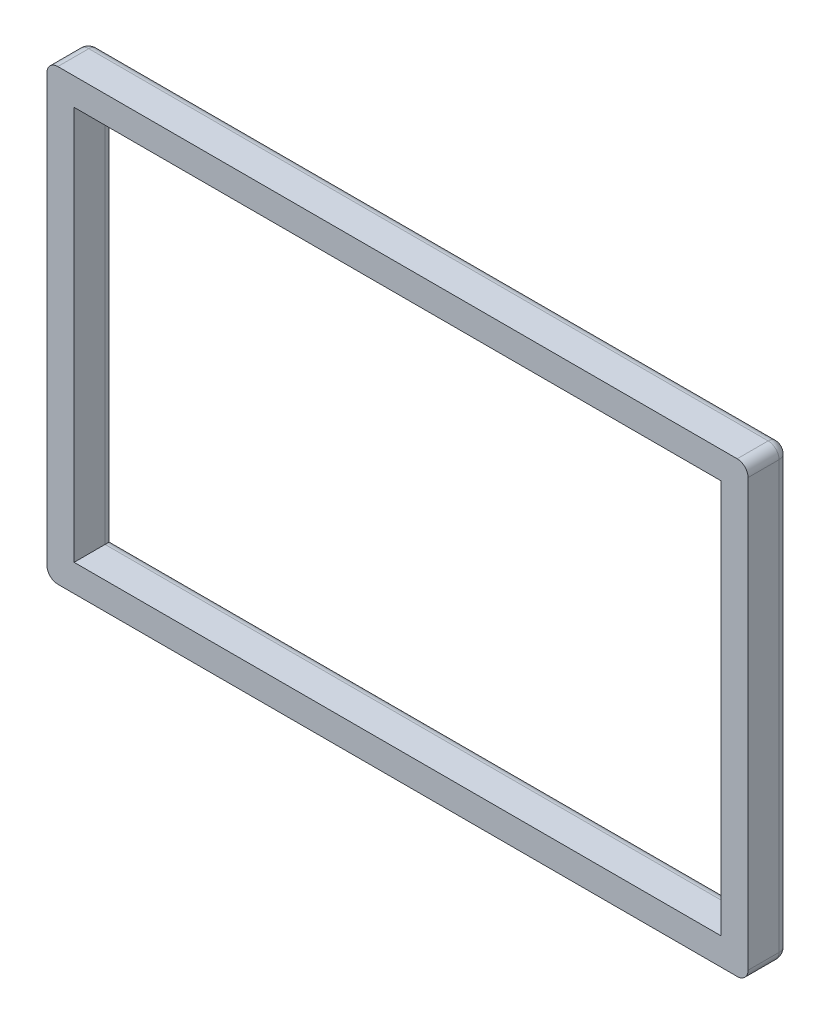
ISO-10303-21;
HEADER;
FILE_DESCRIPTION(('STEP AP214'),'2;1');
FILE_NAME('part.step','',(''),(''),'','','');
FILE_SCHEMA(('AUTOMOTIVE_DESIGN { 1 0 10303 214 1 1 1 1 }'));
ENDSEC;
DATA;
#1=APPLICATION_CONTEXT('core data for automotive mechanical design processes');
#2=APPLICATION_PROTOCOL_DEFINITION('international standard','automotive_design',2000,#1);
#3=PRODUCT_CONTEXT('',#1,'mechanical');
#4=PRODUCT('Part','Part','',(#3));
#5=PRODUCT_RELATED_PRODUCT_CATEGORY('part','',(#4));
#6=PRODUCT_DEFINITION_FORMATION('','',#4);
#7=PRODUCT_DEFINITION_CONTEXT('part definition',#1,'design');
#8=PRODUCT_DEFINITION('design','',#6,#7);
#9=PRODUCT_DEFINITION_SHAPE('','',#8);
#10=(LENGTH_UNIT() NAMED_UNIT(*) SI_UNIT(.MILLI.,.METRE.));
#11=(NAMED_UNIT(*) PLANE_ANGLE_UNIT() SI_UNIT($,.RADIAN.));
#12=(NAMED_UNIT(*) SI_UNIT($,.STERADIAN.) SOLID_ANGLE_UNIT());
#13=UNCERTAINTY_MEASURE_WITH_UNIT(LENGTH_MEASURE(1.E-05),#10,'distance_accuracy_value','');
#14=(GEOMETRIC_REPRESENTATION_CONTEXT(3) GLOBAL_UNCERTAINTY_ASSIGNED_CONTEXT((#13)) GLOBAL_UNIT_ASSIGNED_CONTEXT((#10,
#11,#12)) REPRESENTATION_CONTEXT('',''));
#15=CARTESIAN_POINT('',(0.,0.,0.));
#16=DIRECTION('',(0.,0.,1.));
#17=DIRECTION('',(1.,0.,0.));
#18=AXIS2_PLACEMENT_3D('',#15,#16,#17);
#19=CARTESIAN_POINT('',(0.,0.,9.525));
#20=DIRECTION('',(0.,0.,-1.));
#21=DIRECTION('',(-1.,0.,0.));
#22=AXIS2_PLACEMENT_3D('',#19,#20,#21);
#23=PLANE('',#22);
#24=DIRECTION('',(0.,-1.,0.));
#25=VECTOR('',#24,1.);
#26=CARTESIAN_POINT('',(-81.915,-52.3875,9.525));
#27=LINE('',#26,#25);
#28=CARTESIAN_POINT('',(-81.915,49.8475,9.525));
#29=VERTEX_POINT('',#28);
#30=CARTESIAN_POINT('',(-81.915,-49.8475,9.525));
#31=VERTEX_POINT('',#30);
#32=EDGE_CURVE('E204',#29,#31,#27,.T.);
#33=ORIENTED_EDGE('',*,*,#32,.T.);
#34=CARTESIAN_POINT('',(-79.375,-49.8475,9.525));
#35=DIRECTION('',(0.,0.,-1.));
#36=DIRECTION('',(-1.,0.,0.));
#37=AXIS2_PLACEMENT_3D('',#34,#35,#36);
#38=CIRCLE('',#37,2.54);
#39=CARTESIAN_POINT('',(-79.375,-52.3875,9.525));
#40=VERTEX_POINT('',#39);
#41=EDGE_CURVE('E224',#31,#40,#38,.F.);
#42=ORIENTED_EDGE('',*,*,#41,.T.);
#43=DIRECTION('',(1.,0.,0.));
#44=VECTOR('',#43,1.);
#45=CARTESIAN_POINT('',(-81.915,-52.3875,9.525));
#46=LINE('',#45,#44);
#47=CARTESIAN_POINT('',(79.3749999999999,-52.3875,9.525));
#48=VERTEX_POINT('',#47);
#49=EDGE_CURVE('E207',#40,#48,#46,.T.);
#50=ORIENTED_EDGE('',*,*,#49,.T.);
#51=CARTESIAN_POINT('',(79.375,-49.8475,9.525));
#52=DIRECTION('',(0.,0.,-1.));
#53=DIRECTION('',(-1.,0.,0.));
#54=AXIS2_PLACEMENT_3D('',#51,#52,#53);
#55=CIRCLE('',#54,2.54);
#56=CARTESIAN_POINT('',(81.915,-49.8475,9.525));
#57=VERTEX_POINT('',#56);
#58=EDGE_CURVE('E218',#48,#57,#55,.F.);
#59=ORIENTED_EDGE('',*,*,#58,.T.);
#60=DIRECTION('',(0.,1.,0.));
#61=VECTOR('',#60,1.);
#62=CARTESIAN_POINT('',(81.915,-52.3875,9.525));
#63=LINE('',#62,#61);
#64=CARTESIAN_POINT('',(81.915,49.8475,9.525));
#65=VERTEX_POINT('',#64);
#66=EDGE_CURVE('E183',#57,#65,#63,.T.);
#67=ORIENTED_EDGE('',*,*,#66,.T.);
#68=CARTESIAN_POINT('',(79.375,49.8475,9.525));
#69=DIRECTION('',(0.,0.,-1.));
#70=DIRECTION('',(-1.,0.,0.));
#71=AXIS2_PLACEMENT_3D('',#68,#69,#70);
#72=CIRCLE('',#71,2.54);
#73=CARTESIAN_POINT('',(79.3749999999999,52.3875,9.525));
#74=VERTEX_POINT('',#73);
#75=EDGE_CURVE('E220',#65,#74,#72,.F.);
#76=ORIENTED_EDGE('',*,*,#75,.T.);
#77=DIRECTION('',(-1.,0.,0.));
#78=VECTOR('',#77,1.);
#79=CARTESIAN_POINT('',(-81.915,52.3875,9.525));
#80=LINE('',#79,#78);
#81=CARTESIAN_POINT('',(-79.375,52.3875,9.525));
#82=VERTEX_POINT('',#81);
#83=EDGE_CURVE('E201',#74,#82,#80,.T.);
#84=ORIENTED_EDGE('',*,*,#83,.T.);
#85=CARTESIAN_POINT('',(-79.375,49.8475,9.525));
#86=DIRECTION('',(0.,0.,-1.));
#87=DIRECTION('',(-1.,0.,0.));
#88=AXIS2_PLACEMENT_3D('',#85,#86,#87);
#89=CIRCLE('',#88,2.54);
#90=EDGE_CURVE('E222',#82,#29,#89,.F.);
#91=ORIENTED_EDGE('',*,*,#90,.T.);
#92=EDGE_LOOP('',(#33,#42,#50,#59,#67,#76,#84,#91));
#93=FACE_BOUND('',#92,.T.);
#94=DIRECTION('',(0.,1.,0.));
#95=VECTOR('',#94,1.);
#96=CARTESIAN_POINT('',(75.565,-46.0375,9.525));
#97=LINE('',#96,#95);
#98=CARTESIAN_POINT('',(75.565,-46.0375,9.525));
#99=VERTEX_POINT('',#98);
#100=CARTESIAN_POINT('',(75.565,46.0375,9.525));
#101=VERTEX_POINT('',#100);
#102=EDGE_CURVE('E164',#99,#101,#97,.T.);
#103=ORIENTED_EDGE('',*,*,#102,.F.);
#104=DIRECTION('',(1.,0.,0.));
#105=VECTOR('',#104,1.);
#106=CARTESIAN_POINT('',(-75.565,-46.0375,9.525));
#107=LINE('',#106,#105);
#108=CARTESIAN_POINT('',(-75.565,-46.0375,9.525));
#109=VERTEX_POINT('',#108);
#110=EDGE_CURVE('E190',#109,#99,#107,.T.);
#111=ORIENTED_EDGE('',*,*,#110,.F.);
#112=DIRECTION('',(0.,-1.,0.));
#113=VECTOR('',#112,1.);
#114=CARTESIAN_POINT('',(-75.565,-46.0375,9.525));
#115=LINE('',#114,#113);
#116=CARTESIAN_POINT('',(-75.565,46.0375,9.525));
#117=VERTEX_POINT('',#116);
#118=EDGE_CURVE('E188',#117,#109,#115,.T.);
#119=ORIENTED_EDGE('',*,*,#118,.F.);
#120=DIRECTION('',(-1.,0.,0.));
#121=VECTOR('',#120,1.);
#122=CARTESIAN_POINT('',(-75.565,46.0375,9.525));
#123=LINE('',#122,#121);
#124=EDGE_CURVE('E174',#101,#117,#123,.T.);
#125=ORIENTED_EDGE('',*,*,#124,.F.);
#126=EDGE_LOOP('',(#103,#111,#119,#125));
#127=FACE_BOUND('',#126,.T.);
#128=ADVANCED_FACE('F36',(#93,#127),#23,.F.);
#129=CARTESIAN_POINT('',(0.,0.,0.));
#130=DIRECTION('',(0.,0.,-1.));
#131=DIRECTION('',(-1.,0.,0.));
#132=AXIS2_PLACEMENT_3D('',#129,#130,#131);
#133=PLANE('',#132);
#134=DIRECTION('',(-1.,0.,0.));
#135=VECTOR('',#134,1.);
#136=CARTESIAN_POINT('',(0.,48.3235,0.));
#137=LINE('',#136,#135);
#138=CARTESIAN_POINT('',(77.851,48.3235,0.));
#139=VERTEX_POINT('',#138);
#140=CARTESIAN_POINT('',(-77.851,48.3235,0.));
#141=VERTEX_POINT('',#140);
#142=EDGE_CURVE('E257',#139,#141,#137,.T.);
#143=ORIENTED_EDGE('',*,*,#142,.T.);
#144=DIRECTION('',(0.,-1.,0.));
#145=VECTOR('',#144,1.);
#146=CARTESIAN_POINT('',(-77.851,0.,0.));
#147=LINE('',#146,#145);
#148=CARTESIAN_POINT('',(-77.851,-48.3235,0.));
#149=VERTEX_POINT('',#148);
#150=EDGE_CURVE('E259',#141,#149,#147,.T.);
#151=ORIENTED_EDGE('',*,*,#150,.T.);
#152=DIRECTION('',(1.,0.,0.));
#153=VECTOR('',#152,1.);
#154=CARTESIAN_POINT('',(0.,-48.3235,0.));
#155=LINE('',#154,#153);
#156=CARTESIAN_POINT('',(77.851,-48.3235,0.));
#157=VERTEX_POINT('',#156);
#158=EDGE_CURVE('E253',#149,#157,#155,.T.);
#159=ORIENTED_EDGE('',*,*,#158,.T.);
#160=DIRECTION('',(0.,1.,0.));
#161=VECTOR('',#160,1.);
#162=CARTESIAN_POINT('',(77.851,0.,0.));
#163=LINE('',#162,#161);
#164=EDGE_CURVE('E255',#157,#139,#163,.T.);
#165=ORIENTED_EDGE('',*,*,#164,.T.);
#166=EDGE_LOOP('',(#143,#151,#159,#165));
#167=FACE_BOUND('',#166,.T.);
#168=DIRECTION('',(0.,1.,0.));
#169=VECTOR('',#168,1.);
#170=CARTESIAN_POINT('',(79.629,-49.8475,0.));
#171=LINE('',#170,#169);
#172=CARTESIAN_POINT('',(79.629,49.8475,0.));
#173=VERTEX_POINT('',#172);
#174=CARTESIAN_POINT('',(79.629,-49.8475,0.));
#175=VERTEX_POINT('',#174);
#176=EDGE_CURVE('E248',#173,#175,#171,.F.);
#177=ORIENTED_EDGE('',*,*,#176,.T.);
#178=CARTESIAN_POINT('',(79.375,-49.8475,0.));
#179=DIRECTION('',(0.,0.,-1.));
#180=DIRECTION('',(-1.,0.,0.));
#181=AXIS2_PLACEMENT_3D('',#178,#179,#180);
#182=CIRCLE('',#181,0.254);
#183=CARTESIAN_POINT('',(79.375,-50.1015,0.));
#184=VERTEX_POINT('',#183);
#185=EDGE_CURVE('E250',#175,#184,#182,.T.);
#186=ORIENTED_EDGE('',*,*,#185,.T.);
#187=DIRECTION('',(1.,0.,0.));
#188=VECTOR('',#187,1.);
#189=CARTESIAN_POINT('',(-79.375,-50.1015,0.));
#190=LINE('',#189,#188);
#191=CARTESIAN_POINT('',(-79.375,-50.1015,0.));
#192=VERTEX_POINT('',#191);
#193=EDGE_CURVE('E236',#184,#192,#190,.F.);
#194=ORIENTED_EDGE('',*,*,#193,.T.);
#195=CARTESIAN_POINT('',(-79.375,-49.8475,0.));
#196=DIRECTION('',(0.,0.,-1.));
#197=DIRECTION('',(-1.,0.,0.));
#198=AXIS2_PLACEMENT_3D('',#195,#196,#197);
#199=CIRCLE('',#198,0.254);
#200=CARTESIAN_POINT('',(-79.629,-49.8475,0.));
#201=VERTEX_POINT('',#200);
#202=EDGE_CURVE('E238',#192,#201,#199,.T.);
#203=ORIENTED_EDGE('',*,*,#202,.T.);
#204=DIRECTION('',(0.,-1.,0.));
#205=VECTOR('',#204,1.);
#206=CARTESIAN_POINT('',(-79.629,49.8475,0.));
#207=LINE('',#206,#205);
#208=CARTESIAN_POINT('',(-79.629,49.8475,0.));
#209=VERTEX_POINT('',#208);
#210=EDGE_CURVE('E240',#201,#209,#207,.F.);
#211=ORIENTED_EDGE('',*,*,#210,.T.);
#212=CARTESIAN_POINT('',(-79.375,49.8475,0.));
#213=DIRECTION('',(0.,0.,-1.));
#214=DIRECTION('',(-1.,0.,0.));
#215=AXIS2_PLACEMENT_3D('',#212,#213,#214);
#216=CIRCLE('',#215,0.254);
#217=CARTESIAN_POINT('',(-79.375,50.1015,0.));
#218=VERTEX_POINT('',#217);
#219=EDGE_CURVE('E242',#209,#218,#216,.T.);
#220=ORIENTED_EDGE('',*,*,#219,.T.);
#221=DIRECTION('',(-1.,0.,0.));
#222=VECTOR('',#221,1.);
#223=CARTESIAN_POINT('',(79.3749999999999,50.1015,0.));
#224=LINE('',#223,#222);
#225=CARTESIAN_POINT('',(79.375,50.1015,0.));
#226=VERTEX_POINT('',#225);
#227=EDGE_CURVE('E244',#218,#226,#224,.F.);
#228=ORIENTED_EDGE('',*,*,#227,.T.);
#229=CARTESIAN_POINT('',(79.375,49.8475,0.));
#230=DIRECTION('',(0.,0.,-1.));
#231=DIRECTION('',(-1.,0.,0.));
#232=AXIS2_PLACEMENT_3D('',#229,#230,#231);
#233=CIRCLE('',#232,0.254);
#234=EDGE_CURVE('E246',#226,#173,#233,.T.);
#235=ORIENTED_EDGE('',*,*,#234,.T.);
#236=EDGE_LOOP('',(#177,#186,#194,#203,#211,#220,#228,#235));
#237=FACE_BOUND('',#236,.T.);
#238=ADVANCED_FACE('F375',(#167,#237),#133,.T.);
#239=CARTESIAN_POINT('',(81.915,-52.3875,9.525));
#240=DIRECTION('',(-1.,0.,0.));
#241=DIRECTION('',(0.,0.,1.));
#242=AXIS2_PLACEMENT_3D('',#239,#240,#241);
#243=PLANE('',#242);
#244=DIRECTION('',(0.,0.,-1.));
#245=VECTOR('',#244,1.);
#246=CARTESIAN_POINT('',(81.915,-49.8475,9.525));
#247=LINE('',#246,#245);
#248=CARTESIAN_POINT('',(81.915,-49.8475,2.286));
#249=VERTEX_POINT('',#248);
#250=EDGE_CURVE('E231',#57,#249,#247,.T.);
#251=ORIENTED_EDGE('',*,*,#250,.T.);
#252=DIRECTION('',(0.,1.,0.));
#253=VECTOR('',#252,1.);
#254=CARTESIAN_POINT('',(81.915,49.8475,2.286));
#255=LINE('',#254,#253);
#256=CARTESIAN_POINT('',(81.915,49.8475,2.286));
#257=VERTEX_POINT('',#256);
#258=EDGE_CURVE('E273',#249,#257,#255,.T.);
#259=ORIENTED_EDGE('',*,*,#258,.T.);
#260=DIRECTION('',(0.,0.,-1.));
#261=VECTOR('',#260,1.);
#262=CARTESIAN_POINT('',(81.915,49.8475,9.525));
#263=LINE('',#262,#261);
#264=EDGE_CURVE('E234',#257,#65,#263,.F.);
#265=ORIENTED_EDGE('',*,*,#264,.T.);
#266=ORIENTED_EDGE('',*,*,#66,.F.);
#267=EDGE_LOOP('',(#251,#259,#265,#266));
#268=FACE_BOUND('',#267,.T.);
#269=ADVANCED_FACE('F358',(#268),#243,.F.);
#270=CARTESIAN_POINT('',(-81.915,52.3875,9.525));
#271=DIRECTION('',(0.,-1.,0.));
#272=DIRECTION('',(0.,0.,-1.));
#273=AXIS2_PLACEMENT_3D('',#270,#271,#272);
#274=PLANE('',#273);
#275=DIRECTION('',(0.,0.,-1.));
#276=VECTOR('',#275,1.);
#277=CARTESIAN_POINT('',(79.375,52.3875,9.525));
#278=LINE('',#277,#276);
#279=CARTESIAN_POINT('',(79.375,52.3875,2.286));
#280=VERTEX_POINT('',#279);
#281=EDGE_CURVE('E226',#74,#280,#278,.T.);
#282=ORIENTED_EDGE('',*,*,#281,.T.);
#283=DIRECTION('',(-1.,0.,0.));
#284=VECTOR('',#283,1.);
#285=CARTESIAN_POINT('',(-79.375,52.3875,2.286));
#286=LINE('',#285,#284);
#287=CARTESIAN_POINT('',(-79.375,52.3875,2.286));
#288=VERTEX_POINT('',#287);
#289=EDGE_CURVE('E277',#280,#288,#286,.T.);
#290=ORIENTED_EDGE('',*,*,#289,.T.);
#291=DIRECTION('',(0.,0.,-1.));
#292=VECTOR('',#291,1.);
#293=CARTESIAN_POINT('',(-79.375,52.3875,9.525));
#294=LINE('',#293,#292);
#295=EDGE_CURVE('E229',#288,#82,#294,.F.);
#296=ORIENTED_EDGE('',*,*,#295,.T.);
#297=ORIENTED_EDGE('',*,*,#83,.F.);
#298=EDGE_LOOP('',(#282,#290,#296,#297));
#299=FACE_BOUND('',#298,.T.);
#300=ADVANCED_FACE('F367',(#299),#274,.F.);
#301=CARTESIAN_POINT('',(-81.915,-52.3875,9.525));
#302=DIRECTION('',(1.,0.,0.));
#303=DIRECTION('',(0.,0.,-1.));
#304=AXIS2_PLACEMENT_3D('',#301,#302,#303);
#305=PLANE('',#304);
#306=DIRECTION('',(0.,0.,-1.));
#307=VECTOR('',#306,1.);
#308=CARTESIAN_POINT('',(-81.915,49.8475,9.525));
#309=LINE('',#308,#307);
#310=CARTESIAN_POINT('',(-81.915,49.8475,2.286));
#311=VERTEX_POINT('',#310);
#312=EDGE_CURVE('E214',#29,#311,#309,.T.);
#313=ORIENTED_EDGE('',*,*,#312,.T.);
#314=DIRECTION('',(0.,-1.,0.));
#315=VECTOR('',#314,1.);
#316=CARTESIAN_POINT('',(-81.915,-49.8475,2.286));
#317=LINE('',#316,#315);
#318=CARTESIAN_POINT('',(-81.915,-49.8475,2.286));
#319=VERTEX_POINT('',#318);
#320=EDGE_CURVE('E60',#311,#319,#317,.T.);
#321=ORIENTED_EDGE('',*,*,#320,.T.);
#322=DIRECTION('',(0.,0.,-1.));
#323=VECTOR('',#322,1.);
#324=CARTESIAN_POINT('',(-81.915,-49.8475,9.525));
#325=LINE('',#324,#323);
#326=EDGE_CURVE('E216',#319,#31,#325,.F.);
#327=ORIENTED_EDGE('',*,*,#326,.T.);
#328=ORIENTED_EDGE('',*,*,#32,.F.);
#329=EDGE_LOOP('',(#313,#321,#327,#328));
#330=FACE_BOUND('',#329,.T.);
#331=ADVANCED_FACE('F328',(#330),#305,.F.);
#332=CARTESIAN_POINT('',(-81.915,-52.3875,9.525));
#333=DIRECTION('',(0.,1.,0.));
#334=DIRECTION('',(0.,0.,1.));
#335=AXIS2_PLACEMENT_3D('',#332,#333,#334);
#336=PLANE('',#335);
#337=DIRECTION('',(0.,0.,-1.));
#338=VECTOR('',#337,1.);
#339=CARTESIAN_POINT('',(-79.375,-52.3875,9.525));
#340=LINE('',#339,#338);
#341=CARTESIAN_POINT('',(-79.375,-52.3875,2.286));
#342=VERTEX_POINT('',#341);
#343=EDGE_CURVE('E212',#40,#342,#340,.T.);
#344=ORIENTED_EDGE('',*,*,#343,.T.);
#345=DIRECTION('',(1.,0.,0.));
#346=VECTOR('',#345,1.);
#347=CARTESIAN_POINT('',(79.3749999999999,-52.3875,2.286));
#348=LINE('',#347,#346);
#349=CARTESIAN_POINT('',(79.375,-52.3875,2.286));
#350=VERTEX_POINT('',#349);
#351=EDGE_CURVE('E11',#342,#350,#348,.T.);
#352=ORIENTED_EDGE('',*,*,#351,.T.);
#353=DIRECTION('',(0.,0.,-1.));
#354=VECTOR('',#353,1.);
#355=CARTESIAN_POINT('',(79.375,-52.3875,9.525));
#356=LINE('',#355,#354);
#357=EDGE_CURVE('E210',#350,#48,#356,.F.);
#358=ORIENTED_EDGE('',*,*,#357,.T.);
#359=ORIENTED_EDGE('',*,*,#49,.F.);
#360=EDGE_LOOP('',(#344,#352,#358,#359));
#361=FACE_BOUND('',#360,.T.);
#362=ADVANCED_FACE('F336',(#361),#336,.F.);
#363=CARTESIAN_POINT('',(75.565,-46.0375,9.525));
#364=DIRECTION('',(-1.,0.,0.));
#365=DIRECTION('',(0.,0.,1.));
#366=AXIS2_PLACEMENT_3D('',#363,#364,#365);
#367=PLANE('',#366);
#368=DIRECTION('',(0.,0.,-1.));
#369=VECTOR('',#368,1.);
#370=CARTESIAN_POINT('',(75.565,46.0375,9.525));
#371=LINE('',#370,#369);
#372=CARTESIAN_POINT('',(75.565,46.0375,2.286));
#373=VERTEX_POINT('',#372);
#374=EDGE_CURVE('E167',#101,#373,#371,.T.);
#375=ORIENTED_EDGE('',*,*,#374,.T.);
#376=DIRECTION('',(0.,1.,0.));
#377=VECTOR('',#376,1.);
#378=CARTESIAN_POINT('',(75.565,-46.0375,2.286));
#379=LINE('',#378,#377);
#380=CARTESIAN_POINT('',(75.565,-46.0375,2.286));
#381=VERTEX_POINT('',#380);
#382=EDGE_CURVE('E266',#373,#381,#379,.F.);
#383=ORIENTED_EDGE('',*,*,#382,.T.);
#384=DIRECTION('',(0.,0.,-1.));
#385=VECTOR('',#384,1.);
#386=CARTESIAN_POINT('',(75.565,-46.0375,9.525));
#387=LINE('',#386,#385);
#388=EDGE_CURVE('E170',#99,#381,#387,.T.);
#389=ORIENTED_EDGE('',*,*,#388,.F.);
#390=ORIENTED_EDGE('',*,*,#102,.T.);
#391=EDGE_LOOP('',(#375,#383,#389,#390));
#392=FACE_BOUND('',#391,.T.);
#393=ADVANCED_FACE('F166',(#392),#367,.T.);
#394=CARTESIAN_POINT('',(-75.565,46.0375,9.525));
#395=DIRECTION('',(0.,-1.,0.));
#396=DIRECTION('',(0.,0.,-1.));
#397=AXIS2_PLACEMENT_3D('',#394,#395,#396);
#398=PLANE('',#397);
#399=DIRECTION('',(0.,0.,-1.));
#400=VECTOR('',#399,1.);
#401=CARTESIAN_POINT('',(-75.565,46.0375,9.525));
#402=LINE('',#401,#400);
#403=CARTESIAN_POINT('',(-75.565,46.0375,2.286));
#404=VERTEX_POINT('',#403);
#405=EDGE_CURVE('E184',#117,#404,#402,.T.);
#406=ORIENTED_EDGE('',*,*,#405,.T.);
#407=DIRECTION('',(-1.,0.,0.));
#408=VECTOR('',#407,1.);
#409=CARTESIAN_POINT('',(-75.565,46.0375,2.286));
#410=LINE('',#409,#408);
#411=EDGE_CURVE('E182',#404,#373,#410,.F.);
#412=ORIENTED_EDGE('',*,*,#411,.T.);
#413=ORIENTED_EDGE('',*,*,#374,.F.);
#414=ORIENTED_EDGE('',*,*,#124,.T.);
#415=EDGE_LOOP('',(#406,#412,#413,#414));
#416=FACE_BOUND('',#415,.T.);
#417=ADVANCED_FACE('F179',(#416),#398,.T.);
#418=CARTESIAN_POINT('',(-75.565,-46.0375,9.525));
#419=DIRECTION('',(1.,0.,0.));
#420=DIRECTION('',(0.,0.,-1.));
#421=AXIS2_PLACEMENT_3D('',#418,#419,#420);
#422=PLANE('',#421);
#423=DIRECTION('',(0.,0.,-1.));
#424=VECTOR('',#423,1.);
#425=CARTESIAN_POINT('',(-75.565,-46.0375,9.525));
#426=LINE('',#425,#424);
#427=CARTESIAN_POINT('',(-75.565,-46.0375,2.286));
#428=VERTEX_POINT('',#427);
#429=EDGE_CURVE('E195',#109,#428,#426,.T.);
#430=ORIENTED_EDGE('',*,*,#429,.T.);
#431=DIRECTION('',(0.,-1.,0.));
#432=VECTOR('',#431,1.);
#433=CARTESIAN_POINT('',(-75.565,-46.0375,2.286));
#434=LINE('',#433,#432);
#435=EDGE_CURVE('E262',#428,#404,#434,.F.);
#436=ORIENTED_EDGE('',*,*,#435,.T.);
#437=ORIENTED_EDGE('',*,*,#405,.F.);
#438=ORIENTED_EDGE('',*,*,#118,.T.);
#439=EDGE_LOOP('',(#430,#436,#437,#438));
#440=FACE_BOUND('',#439,.T.);
#441=ADVANCED_FACE('F394',(#440),#422,.T.);
#442=CARTESIAN_POINT('',(-75.565,-46.0375,9.525));
#443=DIRECTION('',(0.,1.,0.));
#444=DIRECTION('',(0.,0.,1.));
#445=AXIS2_PLACEMENT_3D('',#442,#443,#444);
#446=PLANE('',#445);
#447=ORIENTED_EDGE('',*,*,#388,.T.);
#448=DIRECTION('',(1.,0.,0.));
#449=VECTOR('',#448,1.);
#450=CARTESIAN_POINT('',(-75.565,-46.0375,2.286));
#451=LINE('',#450,#449);
#452=EDGE_CURVE('E268',#381,#428,#451,.F.);
#453=ORIENTED_EDGE('',*,*,#452,.T.);
#454=ORIENTED_EDGE('',*,*,#429,.F.);
#455=ORIENTED_EDGE('',*,*,#110,.T.);
#456=EDGE_LOOP('',(#447,#453,#454,#455));
#457=FACE_BOUND('',#456,.T.);
#458=ADVANCED_FACE('F398',(#457),#446,.T.);
#459=CARTESIAN_POINT('',(-79.375,-49.8475,9.525));
#460=DIRECTION('',(0.,0.,-1.));
#461=DIRECTION('',(-1.,0.,0.));
#462=AXIS2_PLACEMENT_3D('',#459,#460,#461);
#463=CYLINDRICAL_SURFACE('',#462,2.54);
#464=ORIENTED_EDGE('',*,*,#326,.F.);
#465=CARTESIAN_POINT('',(-79.375,-49.8475,2.286));
#466=DIRECTION('',(0.,0.,-1.));
#467=DIRECTION('',(-1.,0.,0.));
#468=AXIS2_PLACEMENT_3D('',#465,#466,#467);
#469=CIRCLE('',#468,2.54);
#470=EDGE_CURVE('E45',#319,#342,#469,.F.);
#471=ORIENTED_EDGE('',*,*,#470,.T.);
#472=ORIENTED_EDGE('',*,*,#343,.F.);
#473=ORIENTED_EDGE('',*,*,#41,.F.);
#474=EDGE_LOOP('',(#464,#471,#472,#473));
#475=FACE_BOUND('',#474,.T.);
#476=ADVANCED_FACE('F332',(#475),#463,.T.);
#477=CARTESIAN_POINT('',(-79.375,49.8475,9.525));
#478=DIRECTION('',(0.,0.,-1.));
#479=DIRECTION('',(-1.,0.,0.));
#480=AXIS2_PLACEMENT_3D('',#477,#478,#479);
#481=CYLINDRICAL_SURFACE('',#480,2.54);
#482=ORIENTED_EDGE('',*,*,#295,.F.);
#483=CARTESIAN_POINT('',(-79.375,49.8475,2.286));
#484=DIRECTION('',(0.,0.,-1.));
#485=DIRECTION('',(-1.,0.,0.));
#486=AXIS2_PLACEMENT_3D('',#483,#484,#485);
#487=CIRCLE('',#486,2.54);
#488=EDGE_CURVE('E279',#288,#311,#487,.F.);
#489=ORIENTED_EDGE('',*,*,#488,.T.);
#490=ORIENTED_EDGE('',*,*,#312,.F.);
#491=ORIENTED_EDGE('',*,*,#90,.F.);
#492=EDGE_LOOP('',(#482,#489,#490,#491));
#493=FACE_BOUND('',#492,.T.);
#494=ADVANCED_FACE('F325',(#493),#481,.T.);
#495=CARTESIAN_POINT('',(79.375,49.8475,9.525));
#496=DIRECTION('',(0.,0.,-1.));
#497=DIRECTION('',(-1.,0.,0.));
#498=AXIS2_PLACEMENT_3D('',#495,#496,#497);
#499=CYLINDRICAL_SURFACE('',#498,2.54);
#500=ORIENTED_EDGE('',*,*,#264,.F.);
#501=CARTESIAN_POINT('',(79.375,49.8475,2.286));
#502=DIRECTION('',(0.,0.,-1.));
#503=DIRECTION('',(-1.,0.,0.));
#504=AXIS2_PLACEMENT_3D('',#501,#502,#503);
#505=CIRCLE('',#504,2.54);
#506=EDGE_CURVE('E275',#257,#280,#505,.F.);
#507=ORIENTED_EDGE('',*,*,#506,.T.);
#508=ORIENTED_EDGE('',*,*,#281,.F.);
#509=ORIENTED_EDGE('',*,*,#75,.F.);
#510=EDGE_LOOP('',(#500,#507,#508,#509));
#511=FACE_BOUND('',#510,.T.);
#512=ADVANCED_FACE('F364',(#511),#499,.T.);
#513=CARTESIAN_POINT('',(79.375,-49.8475,9.525));
#514=DIRECTION('',(0.,0.,-1.));
#515=DIRECTION('',(-1.,0.,0.));
#516=AXIS2_PLACEMENT_3D('',#513,#514,#515);
#517=CYLINDRICAL_SURFACE('',#516,2.54);
#518=ORIENTED_EDGE('',*,*,#357,.F.);
#519=CARTESIAN_POINT('',(79.375,-49.8475,2.286));
#520=DIRECTION('',(0.,0.,-1.));
#521=DIRECTION('',(-1.,0.,0.));
#522=AXIS2_PLACEMENT_3D('',#519,#520,#521);
#523=CIRCLE('',#522,2.54);
#524=EDGE_CURVE('E270',#350,#249,#523,.F.);
#525=ORIENTED_EDGE('',*,*,#524,.T.);
#526=ORIENTED_EDGE('',*,*,#250,.F.);
#527=ORIENTED_EDGE('',*,*,#58,.F.);
#528=EDGE_LOOP('',(#518,#525,#526,#527));
#529=FACE_BOUND('',#528,.T.);
#530=ADVANCED_FACE('F354',(#529),#517,.T.);
#531=CARTESIAN_POINT('',(77.851,0.,2.286));
#532=DIRECTION('',(0.,1.,0.));
#533=DIRECTION('',(0.,0.,1.));
#534=AXIS2_PLACEMENT_3D('',#531,#532,#533);
#535=CYLINDRICAL_SURFACE('',#534,2.286);
#536=CARTESIAN_POINT('',(77.851,-48.3235,2.286));
#537=DIRECTION('',(0.707106781186547,0.707106781186547,0.));
#538=DIRECTION('',(-0.707106781186547,0.707106781186547,0.));
#539=AXIS2_PLACEMENT_3D('',#536,#537,#538);
#540=ELLIPSE('',#539,3.23289220358489,2.286);
#541=EDGE_CURVE('E287',#381,#157,#540,.F.);
#542=ORIENTED_EDGE('',*,*,#541,.F.);
#543=ORIENTED_EDGE('',*,*,#382,.F.);
#544=CARTESIAN_POINT('',(77.851,48.3235,2.286));
#545=DIRECTION('',(-0.707106781186547,0.707106781186547,0.));
#546=DIRECTION('',(-0.707106781186547,-0.707106781186547,0.));
#547=AXIS2_PLACEMENT_3D('',#544,#545,#546);
#548=ELLIPSE('',#547,3.23289220358489,2.286);
#549=EDGE_CURVE('E175',#139,#373,#548,.T.);
#550=ORIENTED_EDGE('',*,*,#549,.F.);
#551=ORIENTED_EDGE('',*,*,#164,.F.);
#552=EDGE_LOOP('',(#542,#543,#550,#551));
#553=FACE_BOUND('',#552,.T.);
#554=ADVANCED_FACE('F412',(#553),#535,.T.);
#555=CARTESIAN_POINT('',(0.,48.3235,2.286));
#556=DIRECTION('',(-1.,0.,0.));
#557=DIRECTION('',(0.,0.,1.));
#558=AXIS2_PLACEMENT_3D('',#555,#556,#557);
#559=CYLINDRICAL_SURFACE('',#558,2.286);
#560=ORIENTED_EDGE('',*,*,#549,.T.);
#561=ORIENTED_EDGE('',*,*,#411,.F.);
#562=CARTESIAN_POINT('',(-77.851,48.3235,2.286));
#563=DIRECTION('',(-0.707106781186547,-0.707106781186547,0.));
#564=DIRECTION('',(0.707106781186547,-0.707106781186547,0.));
#565=AXIS2_PLACEMENT_3D('',#562,#563,#564);
#566=ELLIPSE('',#565,3.23289220358489,2.286);
#567=EDGE_CURVE('E285',#141,#404,#566,.T.);
#568=ORIENTED_EDGE('',*,*,#567,.F.);
#569=ORIENTED_EDGE('',*,*,#142,.F.);
#570=EDGE_LOOP('',(#560,#561,#568,#569));
#571=FACE_BOUND('',#570,.T.);
#572=ADVANCED_FACE('F425',(#571),#559,.T.);
#573=CARTESIAN_POINT('',(0.,-48.3235,2.286));
#574=DIRECTION('',(1.,0.,0.));
#575=DIRECTION('',(0.,0.,-1.));
#576=AXIS2_PLACEMENT_3D('',#573,#574,#575);
#577=CYLINDRICAL_SURFACE('',#576,2.286);
#578=ORIENTED_EDGE('',*,*,#541,.T.);
#579=ORIENTED_EDGE('',*,*,#158,.F.);
#580=CARTESIAN_POINT('',(-77.851,-48.3235,2.286));
#581=DIRECTION('',(0.707106781186547,-0.707106781186547,0.));
#582=DIRECTION('',(-0.707106781186547,-0.707106781186547,0.));
#583=AXIS2_PLACEMENT_3D('',#580,#581,#582);
#584=ELLIPSE('',#583,3.23289220358489,2.286);
#585=EDGE_CURVE('E283',#428,#149,#584,.F.);
#586=ORIENTED_EDGE('',*,*,#585,.F.);
#587=ORIENTED_EDGE('',*,*,#452,.F.);
#588=EDGE_LOOP('',(#578,#579,#586,#587));
#589=FACE_BOUND('',#588,.T.);
#590=ADVANCED_FACE('F417',(#589),#577,.T.);
#591=CARTESIAN_POINT('',(-77.851,0.,2.286));
#592=DIRECTION('',(0.,-1.,0.));
#593=DIRECTION('',(0.,0.,-1.));
#594=AXIS2_PLACEMENT_3D('',#591,#592,#593);
#595=CYLINDRICAL_SURFACE('',#594,2.286);
#596=ORIENTED_EDGE('',*,*,#567,.T.);
#597=ORIENTED_EDGE('',*,*,#435,.F.);
#598=ORIENTED_EDGE('',*,*,#585,.T.);
#599=ORIENTED_EDGE('',*,*,#150,.F.);
#600=EDGE_LOOP('',(#596,#597,#598,#599));
#601=FACE_BOUND('',#600,.T.);
#602=ADVANCED_FACE('F421',(#601),#595,.T.);
#603=CARTESIAN_POINT('',(-79.375,49.8475,2.286));
#604=DIRECTION('',(0.,0.,-1.));
#605=DIRECTION('',(-1.,0.,0.));
#606=AXIS2_PLACEMENT_3D('',#603,#604,#605);
#607=DEGENERATE_TOROIDAL_SURFACE('',#606,0.254,2.286,.T.);
#608=CARTESIAN_POINT('',(-79.629,49.8475,2.286));
#609=DIRECTION('',(0.,-1.,0.));
#610=DIRECTION('',(0.,0.,-1.));
#611=AXIS2_PLACEMENT_3D('',#608,#609,#610);
#612=CIRCLE('',#611,2.286);
#613=EDGE_CURVE('E307',#311,#209,#612,.T.);
#614=ORIENTED_EDGE('',*,*,#613,.F.);
#615=ORIENTED_EDGE('',*,*,#488,.F.);
#616=CARTESIAN_POINT('',(-79.375,50.1015,2.286));
#617=DIRECTION('',(1.,0.,0.));
#618=DIRECTION('',(0.,0.,-1.));
#619=AXIS2_PLACEMENT_3D('',#616,#617,#618);
#620=CIRCLE('',#619,2.286);
#621=EDGE_CURVE('E40',#218,#288,#620,.T.);
#622=ORIENTED_EDGE('',*,*,#621,.F.);
#623=ORIENTED_EDGE('',*,*,#219,.F.);
#624=EDGE_LOOP('',(#614,#615,#622,#623));
#625=FACE_BOUND('',#624,.T.);
#626=ADVANCED_FACE('F38',(#625),#607,.T.);
#627=CARTESIAN_POINT('',(-81.915,50.1015,2.286));
#628=DIRECTION('',(1.,0.,0.));
#629=DIRECTION('',(0.,0.,-1.));
#630=AXIS2_PLACEMENT_3D('',#627,#628,#629);
#631=CYLINDRICAL_SURFACE('',#630,2.286);
#632=ORIENTED_EDGE('',*,*,#621,.T.);
#633=ORIENTED_EDGE('',*,*,#289,.F.);
#634=CARTESIAN_POINT('',(79.375,50.1015,2.286));
#635=DIRECTION('',(1.,0.,0.));
#636=DIRECTION('',(0.,0.,-1.));
#637=AXIS2_PLACEMENT_3D('',#634,#635,#636);
#638=CIRCLE('',#637,2.286);
#639=EDGE_CURVE('E305',#226,#280,#638,.T.);
#640=ORIENTED_EDGE('',*,*,#639,.F.);
#641=ORIENTED_EDGE('',*,*,#227,.F.);
#642=EDGE_LOOP('',(#632,#633,#640,#641));
#643=FACE_BOUND('',#642,.T.);
#644=ADVANCED_FACE('F317',(#643),#631,.T.);
#645=CARTESIAN_POINT('',(-79.629,-52.3875,2.286));
#646=DIRECTION('',(0.,1.,0.));
#647=DIRECTION('',(0.,0.,1.));
#648=AXIS2_PLACEMENT_3D('',#645,#646,#647);
#649=CYLINDRICAL_SURFACE('',#648,2.286);
#650=ORIENTED_EDGE('',*,*,#613,.T.);
#651=ORIENTED_EDGE('',*,*,#210,.F.);
#652=CARTESIAN_POINT('',(-79.629,-49.8475,2.286));
#653=DIRECTION('',(0.,-1.,0.));
#654=DIRECTION('',(0.,0.,-1.));
#655=AXIS2_PLACEMENT_3D('',#652,#653,#654);
#656=CIRCLE('',#655,2.286);
#657=EDGE_CURVE('E302',#319,#201,#656,.T.);
#658=ORIENTED_EDGE('',*,*,#657,.F.);
#659=ORIENTED_EDGE('',*,*,#320,.F.);
#660=EDGE_LOOP('',(#650,#651,#658,#659));
#661=FACE_BOUND('',#660,.T.);
#662=ADVANCED_FACE('F435',(#661),#649,.T.);
#663=CARTESIAN_POINT('',(79.375,49.8475,2.286));
#664=DIRECTION('',(0.,0.,-1.));
#665=DIRECTION('',(-1.,0.,0.));
#666=AXIS2_PLACEMENT_3D('',#663,#664,#665);
#667=DEGENERATE_TOROIDAL_SURFACE('',#666,0.254,2.286,.T.);
#668=ORIENTED_EDGE('',*,*,#639,.T.);
#669=ORIENTED_EDGE('',*,*,#506,.F.);
#670=CARTESIAN_POINT('',(79.629,49.8475,2.286));
#671=DIRECTION('',(0.,-1.,0.));
#672=DIRECTION('',(0.,0.,-1.));
#673=AXIS2_PLACEMENT_3D('',#670,#671,#672);
#674=CIRCLE('',#673,2.286);
#675=EDGE_CURVE('E299',#173,#257,#674,.T.);
#676=ORIENTED_EDGE('',*,*,#675,.F.);
#677=ORIENTED_EDGE('',*,*,#234,.F.);
#678=EDGE_LOOP('',(#668,#669,#676,#677));
#679=FACE_BOUND('',#678,.T.);
#680=ADVANCED_FACE('F433',(#679),#667,.T.);
#681=CARTESIAN_POINT('',(-79.375,-49.8475,2.286));
#682=DIRECTION('',(0.,0.,-1.));
#683=DIRECTION('',(-1.,0.,0.));
#684=AXIS2_PLACEMENT_3D('',#681,#682,#683);
#685=DEGENERATE_TOROIDAL_SURFACE('',#684,0.254,2.286,.T.);
#686=ORIENTED_EDGE('',*,*,#657,.T.);
#687=ORIENTED_EDGE('',*,*,#202,.F.);
#688=CARTESIAN_POINT('',(-79.375,-50.1015,2.286));
#689=DIRECTION('',(1.,0.,0.));
#690=DIRECTION('',(0.,0.,-1.));
#691=AXIS2_PLACEMENT_3D('',#688,#689,#690);
#692=CIRCLE('',#691,2.286);
#693=EDGE_CURVE('E296',#342,#192,#692,.T.);
#694=ORIENTED_EDGE('',*,*,#693,.F.);
#695=ORIENTED_EDGE('',*,*,#470,.F.);
#696=EDGE_LOOP('',(#686,#687,#694,#695));
#697=FACE_BOUND('',#696,.T.);
#698=ADVANCED_FACE('F341',(#697),#685,.T.);
#699=CARTESIAN_POINT('',(79.629,-52.3875,2.286));
#700=DIRECTION('',(0.,-1.,0.));
#701=DIRECTION('',(0.,0.,-1.));
#702=AXIS2_PLACEMENT_3D('',#699,#700,#701);
#703=CYLINDRICAL_SURFACE('',#702,2.286);
#704=ORIENTED_EDGE('',*,*,#675,.T.);
#705=ORIENTED_EDGE('',*,*,#258,.F.);
#706=CARTESIAN_POINT('',(79.629,-49.8475,2.286));
#707=DIRECTION('',(0.,-1.,0.));
#708=DIRECTION('',(0.,0.,-1.));
#709=AXIS2_PLACEMENT_3D('',#706,#707,#708);
#710=CIRCLE('',#709,2.286);
#711=EDGE_CURVE('E294',#175,#249,#710,.T.);
#712=ORIENTED_EDGE('',*,*,#711,.F.);
#713=ORIENTED_EDGE('',*,*,#176,.F.);
#714=EDGE_LOOP('',(#704,#705,#712,#713));
#715=FACE_BOUND('',#714,.T.);
#716=ADVANCED_FACE('F431',(#715),#703,.T.);
#717=CARTESIAN_POINT('',(-81.915,-50.1015,2.286));
#718=DIRECTION('',(-1.,0.,0.));
#719=DIRECTION('',(0.,0.,1.));
#720=AXIS2_PLACEMENT_3D('',#717,#718,#719);
#721=CYLINDRICAL_SURFACE('',#720,2.286);
#722=ORIENTED_EDGE('',*,*,#693,.T.);
#723=ORIENTED_EDGE('',*,*,#193,.F.);
#724=CARTESIAN_POINT('',(79.375,-50.1015,2.286));
#725=DIRECTION('',(1.,0.,0.));
#726=DIRECTION('',(0.,0.,-1.));
#727=AXIS2_PLACEMENT_3D('',#724,#725,#726);
#728=CIRCLE('',#727,2.286);
#729=EDGE_CURVE('E292',#350,#184,#728,.T.);
#730=ORIENTED_EDGE('',*,*,#729,.F.);
#731=ORIENTED_EDGE('',*,*,#351,.F.);
#732=EDGE_LOOP('',(#722,#723,#730,#731));
#733=FACE_BOUND('',#732,.T.);
#734=ADVANCED_FACE('F345',(#733),#721,.T.);
#735=CARTESIAN_POINT('',(79.375,-49.8475,2.286));
#736=DIRECTION('',(0.,0.,-1.));
#737=DIRECTION('',(-1.,0.,0.));
#738=AXIS2_PLACEMENT_3D('',#735,#736,#737);
#739=DEGENERATE_TOROIDAL_SURFACE('',#738,0.254,2.286,.T.);
#740=ORIENTED_EDGE('',*,*,#711,.T.);
#741=ORIENTED_EDGE('',*,*,#524,.F.);
#742=ORIENTED_EDGE('',*,*,#729,.T.);
#743=ORIENTED_EDGE('',*,*,#185,.F.);
#744=EDGE_LOOP('',(#740,#741,#742,#743));
#745=FACE_BOUND('',#744,.T.);
#746=ADVANCED_FACE('F349',(#745),#739,.T.);
#747=CLOSED_SHELL('',(#128,#238,#269,#300,#331,#362,#393,#417,#441,#458,#476,#494,#512,#530,
#554,#572,#590,#602,#626,#644,#662,#680,#698,#716,#734,#746));
#748=MANIFOLD_SOLID_BREP('B2',#747);
#749=ADVANCED_BREP_SHAPE_REPRESENTATION('',(#18,#748),#14);
#750=SHAPE_DEFINITION_REPRESENTATION(#9,#749);
ENDSEC;
END-ISO-10303-21;
